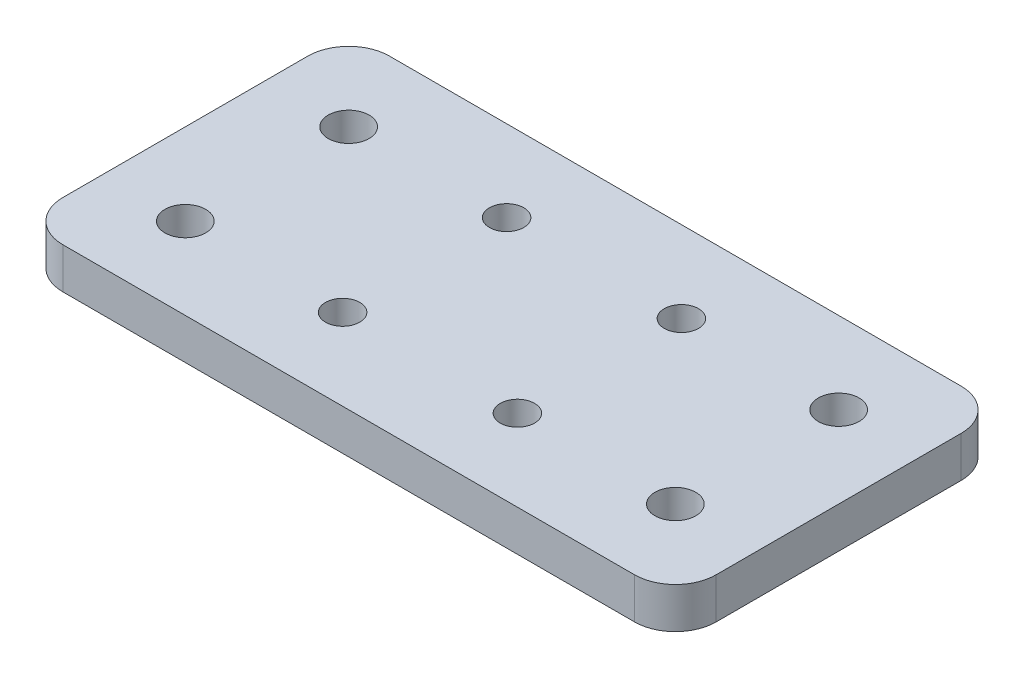
ISO-10303-21;
HEADER;
FILE_DESCRIPTION(('STEP AP214'),'2;1');
FILE_NAME('part.step','',(''),(''),'','','');
FILE_SCHEMA(('AUTOMOTIVE_DESIGN { 1 0 10303 214 1 1 1 1 }'));
ENDSEC;
DATA;
#1=APPLICATION_CONTEXT('core data for automotive mechanical design processes');
#2=APPLICATION_PROTOCOL_DEFINITION('international standard','automotive_design',2000,#1);
#3=PRODUCT_CONTEXT('',#1,'mechanical');
#4=PRODUCT('Part','Part','',(#3));
#5=PRODUCT_RELATED_PRODUCT_CATEGORY('part','',(#4));
#6=PRODUCT_DEFINITION_FORMATION('','',#4);
#7=PRODUCT_DEFINITION_CONTEXT('part definition',#1,'design');
#8=PRODUCT_DEFINITION('design','',#6,#7);
#9=PRODUCT_DEFINITION_SHAPE('','',#8);
#10=(LENGTH_UNIT() NAMED_UNIT(*) SI_UNIT(.MILLI.,.METRE.));
#11=(NAMED_UNIT(*) PLANE_ANGLE_UNIT() SI_UNIT($,.RADIAN.));
#12=(NAMED_UNIT(*) SI_UNIT($,.STERADIAN.) SOLID_ANGLE_UNIT());
#13=UNCERTAINTY_MEASURE_WITH_UNIT(LENGTH_MEASURE(1.E-05),#10,'distance_accuracy_value','');
#14=(GEOMETRIC_REPRESENTATION_CONTEXT(3) GLOBAL_UNCERTAINTY_ASSIGNED_CONTEXT((#13)) GLOBAL_UNIT_ASSIGNED_CONTEXT((#10,
#11,#12)) REPRESENTATION_CONTEXT('',''));
#15=CARTESIAN_POINT('',(0.,0.,0.));
#16=DIRECTION('',(0.,0.,1.));
#17=DIRECTION('',(1.,0.,0.));
#18=AXIS2_PLACEMENT_3D('',#15,#16,#17);
#19=CARTESIAN_POINT('',(50.8,6.35,-25.4));
#20=DIRECTION('',(-1.,0.,0.));
#21=DIRECTION('',(0.,0.,1.));
#22=AXIS2_PLACEMENT_3D('',#19,#20,#21);
#23=PLANE('',#22);
#24=DIRECTION('',(0.,0.,-1.));
#25=VECTOR('',#24,1.);
#26=CARTESIAN_POINT('',(50.8,0.,-25.4));
#27=LINE('',#26,#25);
#28=CARTESIAN_POINT('',(50.8,0.,19.05));
#29=VERTEX_POINT('',#28);
#30=CARTESIAN_POINT('',(50.8,0.,-19.05));
#31=VERTEX_POINT('',#30);
#32=EDGE_CURVE('E128',#29,#31,#27,.T.);
#33=ORIENTED_EDGE('',*,*,#32,.T.);
#34=DIRECTION('',(0.,-1.,0.));
#35=VECTOR('',#34,1.);
#36=CARTESIAN_POINT('',(50.8,6.35,-19.05));
#37=LINE('',#36,#35);
#38=CARTESIAN_POINT('',(50.8,6.35,-19.05));
#39=VERTEX_POINT('',#38);
#40=EDGE_CURVE('E151',#31,#39,#37,.F.);
#41=ORIENTED_EDGE('',*,*,#40,.T.);
#42=DIRECTION('',(0.,0.,-1.));
#43=VECTOR('',#42,1.);
#44=CARTESIAN_POINT('',(50.8,6.35,-25.4));
#45=LINE('',#44,#43);
#46=CARTESIAN_POINT('',(50.8,6.35,19.05));
#47=VERTEX_POINT('',#46);
#48=EDGE_CURVE('E126',#47,#39,#45,.T.);
#49=ORIENTED_EDGE('',*,*,#48,.F.);
#50=DIRECTION('',(0.,-1.,0.));
#51=VECTOR('',#50,1.);
#52=CARTESIAN_POINT('',(50.8,6.35,19.05));
#53=LINE('',#52,#51);
#54=EDGE_CURVE('E148',#47,#29,#53,.T.);
#55=ORIENTED_EDGE('',*,*,#54,.T.);
#56=EDGE_LOOP('',(#33,#41,#49,#55));
#57=FACE_BOUND('',#56,.T.);
#58=ADVANCED_FACE('F33',(#57),#23,.F.);
#59=CARTESIAN_POINT('',(-50.8,6.35,-25.4));
#60=DIRECTION('',(0.,0.,1.));
#61=DIRECTION('',(1.,0.,0.));
#62=AXIS2_PLACEMENT_3D('',#59,#60,#61);
#63=PLANE('',#62);
#64=DIRECTION('',(-1.,0.,0.));
#65=VECTOR('',#64,1.);
#66=CARTESIAN_POINT('',(-50.8,0.,-25.4));
#67=LINE('',#66,#65);
#68=CARTESIAN_POINT('',(44.45,0.,-25.4));
#69=VERTEX_POINT('',#68);
#70=CARTESIAN_POINT('',(-44.45,0.,-25.4));
#71=VERTEX_POINT('',#70);
#72=EDGE_CURVE('E124',#69,#71,#67,.T.);
#73=ORIENTED_EDGE('',*,*,#72,.T.);
#74=DIRECTION('',(0.,-1.,0.));
#75=VECTOR('',#74,1.);
#76=CARTESIAN_POINT('',(-44.45,6.35,-25.4));
#77=LINE('',#76,#75);
#78=CARTESIAN_POINT('',(-44.45,6.35,-25.4));
#79=VERTEX_POINT('',#78);
#80=EDGE_CURVE('E103',#71,#79,#77,.F.);
#81=ORIENTED_EDGE('',*,*,#80,.T.);
#82=DIRECTION('',(-1.,0.,0.));
#83=VECTOR('',#82,1.);
#84=CARTESIAN_POINT('',(-50.8,6.35,-25.4));
#85=LINE('',#84,#83);
#86=CARTESIAN_POINT('',(44.45,6.35,-25.4));
#87=VERTEX_POINT('',#86);
#88=EDGE_CURVE('E167',#87,#79,#85,.T.);
#89=ORIENTED_EDGE('',*,*,#88,.F.);
#90=DIRECTION('',(0.,-1.,0.));
#91=VECTOR('',#90,1.);
#92=CARTESIAN_POINT('',(44.45,6.35,-25.4));
#93=LINE('',#92,#91);
#94=EDGE_CURVE('E108',#87,#69,#93,.T.);
#95=ORIENTED_EDGE('',*,*,#94,.T.);
#96=EDGE_LOOP('',(#73,#81,#89,#95));
#97=FACE_BOUND('',#96,.T.);
#98=ADVANCED_FACE('F261',(#97),#63,.F.);
#99=CARTESIAN_POINT('',(-50.8,6.35,-25.4));
#100=DIRECTION('',(1.,0.,0.));
#101=DIRECTION('',(0.,0.,-1.));
#102=AXIS2_PLACEMENT_3D('',#99,#100,#101);
#103=PLANE('',#102);
#104=DIRECTION('',(0.,0.,1.));
#105=VECTOR('',#104,1.);
#106=CARTESIAN_POINT('',(-50.8,6.35,-25.4));
#107=LINE('',#106,#105);
#108=CARTESIAN_POINT('',(-50.8,6.35,-19.05));
#109=VERTEX_POINT('',#108);
#110=CARTESIAN_POINT('',(-50.8,6.35,19.05));
#111=VERTEX_POINT('',#110);
#112=EDGE_CURVE('E117',#109,#111,#107,.T.);
#113=ORIENTED_EDGE('',*,*,#112,.F.);
#114=DIRECTION('',(0.,-1.,0.));
#115=VECTOR('',#114,1.);
#116=CARTESIAN_POINT('',(-50.8,6.35,-19.05));
#117=LINE('',#116,#115);
#118=CARTESIAN_POINT('',(-50.8,0.,-19.05));
#119=VERTEX_POINT('',#118);
#120=EDGE_CURVE('E102',#109,#119,#117,.T.);
#121=ORIENTED_EDGE('',*,*,#120,.T.);
#122=DIRECTION('',(0.,0.,1.));
#123=VECTOR('',#122,1.);
#124=CARTESIAN_POINT('',(-50.8,0.,-25.4));
#125=LINE('',#124,#123);
#126=CARTESIAN_POINT('',(-50.8,0.,19.05));
#127=VERTEX_POINT('',#126);
#128=EDGE_CURVE('E115',#119,#127,#125,.T.);
#129=ORIENTED_EDGE('',*,*,#128,.T.);
#130=DIRECTION('',(0.,-1.,0.));
#131=VECTOR('',#130,1.);
#132=CARTESIAN_POINT('',(-50.8,6.35,19.05));
#133=LINE('',#132,#131);
#134=EDGE_CURVE('E119',#127,#111,#133,.F.);
#135=ORIENTED_EDGE('',*,*,#134,.T.);
#136=EDGE_LOOP('',(#113,#121,#129,#135));
#137=FACE_BOUND('',#136,.T.);
#138=ADVANCED_FACE('F114',(#137),#103,.F.);
#139=CARTESIAN_POINT('',(-50.8,6.35,25.4));
#140=DIRECTION('',(0.,0.,-1.));
#141=DIRECTION('',(-1.,0.,0.));
#142=AXIS2_PLACEMENT_3D('',#139,#140,#141);
#143=PLANE('',#142);
#144=DIRECTION('',(1.,0.,0.));
#145=VECTOR('',#144,1.);
#146=CARTESIAN_POINT('',(-50.8,0.,25.4));
#147=LINE('',#146,#145);
#148=CARTESIAN_POINT('',(-44.45,0.,25.4));
#149=VERTEX_POINT('',#148);
#150=CARTESIAN_POINT('',(44.45,0.,25.4));
#151=VERTEX_POINT('',#150);
#152=EDGE_CURVE('E123',#149,#151,#147,.T.);
#153=ORIENTED_EDGE('',*,*,#152,.T.);
#154=DIRECTION('',(0.,-1.,0.));
#155=VECTOR('',#154,1.);
#156=CARTESIAN_POINT('',(44.45,6.35,25.4));
#157=LINE('',#156,#155);
#158=CARTESIAN_POINT('',(44.45,6.35,25.4));
#159=VERTEX_POINT('',#158);
#160=EDGE_CURVE('E11',#151,#159,#157,.F.);
#161=ORIENTED_EDGE('',*,*,#160,.T.);
#162=DIRECTION('',(1.,0.,0.));
#163=VECTOR('',#162,1.);
#164=CARTESIAN_POINT('',(-50.8,6.35,25.4));
#165=LINE('',#164,#163);
#166=CARTESIAN_POINT('',(-44.45,6.35,25.4));
#167=VERTEX_POINT('',#166);
#168=EDGE_CURVE('E132',#167,#159,#165,.T.);
#169=ORIENTED_EDGE('',*,*,#168,.F.);
#170=DIRECTION('',(0.,-1.,0.));
#171=VECTOR('',#170,1.);
#172=CARTESIAN_POINT('',(-44.45,6.35,25.4));
#173=LINE('',#172,#171);
#174=EDGE_CURVE('E41',#167,#149,#173,.T.);
#175=ORIENTED_EDGE('',*,*,#174,.T.);
#176=EDGE_LOOP('',(#153,#161,#169,#175));
#177=FACE_BOUND('',#176,.T.);
#178=ADVANCED_FACE('F154',(#177),#143,.F.);
#179=CARTESIAN_POINT('',(0.,6.35,0.));
#180=DIRECTION('',(0.,1.,0.));
#181=DIRECTION('',(0.,0.,1.));
#182=AXIS2_PLACEMENT_3D('',#179,#180,#181);
#183=PLANE('',#182);
#184=CARTESIAN_POINT('',(-13.589,6.35,12.75));
#185=DIRECTION('',(0.,1.,0.));
#186=DIRECTION('',(0.,0.,1.));
#187=AXIS2_PLACEMENT_3D('',#184,#185,#186);
#188=CIRCLE('',#187,2.667);
#189=CARTESIAN_POINT('',(-13.589,6.35,15.417));
#190=VERTEX_POINT('',#189);
#191=EDGE_CURVE('E219',#190,#190,#188,.F.);
#192=ORIENTED_EDGE('',*,*,#191,.T.);
#193=EDGE_LOOP('',(#192));
#194=FACE_BOUND('',#193,.T.);
#195=CARTESIAN_POINT('',(13.589,6.35,12.75));
#196=DIRECTION('',(0.,1.,0.));
#197=DIRECTION('',(0.,0.,1.));
#198=AXIS2_PLACEMENT_3D('',#195,#196,#197);
#199=CIRCLE('',#198,2.667);
#200=CARTESIAN_POINT('',(13.589,6.35,15.417));
#201=VERTEX_POINT('',#200);
#202=EDGE_CURVE('E213',#201,#201,#199,.F.);
#203=ORIENTED_EDGE('',*,*,#202,.T.);
#204=EDGE_LOOP('',(#203));
#205=FACE_BOUND('',#204,.T.);
#206=CARTESIAN_POINT('',(-13.589,6.35,-12.75));
#207=DIRECTION('',(0.,1.,0.));
#208=DIRECTION('',(0.,0.,1.));
#209=AXIS2_PLACEMENT_3D('',#206,#207,#208);
#210=CIRCLE('',#209,2.667);
#211=CARTESIAN_POINT('',(-13.589,6.35,-10.083));
#212=VERTEX_POINT('',#211);
#213=EDGE_CURVE('E207',#212,#212,#210,.F.);
#214=ORIENTED_EDGE('',*,*,#213,.T.);
#215=EDGE_LOOP('',(#214));
#216=FACE_BOUND('',#215,.T.);
#217=CARTESIAN_POINT('',(13.589,6.35,-12.75));
#218=DIRECTION('',(0.,1.,0.));
#219=DIRECTION('',(0.,0.,1.));
#220=AXIS2_PLACEMENT_3D('',#217,#218,#219);
#221=CIRCLE('',#220,2.667);
#222=CARTESIAN_POINT('',(13.589,6.35,-10.083));
#223=VERTEX_POINT('',#222);
#224=EDGE_CURVE('E201',#223,#223,#221,.F.);
#225=ORIENTED_EDGE('',*,*,#224,.T.);
#226=EDGE_LOOP('',(#225));
#227=FACE_BOUND('',#226,.T.);
#228=CARTESIAN_POINT('',(38.1,6.35,-12.7));
#229=DIRECTION('',(0.,1.,0.));
#230=DIRECTION('',(0.,0.,1.));
#231=AXIS2_PLACEMENT_3D('',#228,#229,#230);
#232=CIRCLE('',#231,3.175);
#233=CARTESIAN_POINT('',(38.1,6.35,-9.525));
#234=VERTEX_POINT('',#233);
#235=EDGE_CURVE('E195',#234,#234,#232,.F.);
#236=ORIENTED_EDGE('',*,*,#235,.T.);
#237=EDGE_LOOP('',(#236));
#238=FACE_BOUND('',#237,.T.);
#239=CARTESIAN_POINT('',(38.1,6.35,12.7));
#240=DIRECTION('',(0.,1.,0.));
#241=DIRECTION('',(0.,0.,1.));
#242=AXIS2_PLACEMENT_3D('',#239,#240,#241);
#243=CIRCLE('',#242,3.175);
#244=CARTESIAN_POINT('',(38.1,6.35,15.875));
#245=VERTEX_POINT('',#244);
#246=EDGE_CURVE('E189',#245,#245,#243,.F.);
#247=ORIENTED_EDGE('',*,*,#246,.T.);
#248=EDGE_LOOP('',(#247));
#249=FACE_BOUND('',#248,.T.);
#250=CARTESIAN_POINT('',(-38.1,6.35,-12.7));
#251=DIRECTION('',(0.,1.,0.));
#252=DIRECTION('',(0.,0.,1.));
#253=AXIS2_PLACEMENT_3D('',#250,#251,#252);
#254=CIRCLE('',#253,3.175);
#255=CARTESIAN_POINT('',(-38.1,6.35,-9.52500000000001));
#256=VERTEX_POINT('',#255);
#257=EDGE_CURVE('E183',#256,#256,#254,.F.);
#258=ORIENTED_EDGE('',*,*,#257,.T.);
#259=EDGE_LOOP('',(#258));
#260=FACE_BOUND('',#259,.T.);
#261=CARTESIAN_POINT('',(-38.1,6.35,12.7));
#262=DIRECTION('',(0.,1.,0.));
#263=DIRECTION('',(0.,0.,1.));
#264=AXIS2_PLACEMENT_3D('',#261,#262,#263);
#265=CIRCLE('',#264,3.175);
#266=CARTESIAN_POINT('',(-38.1,6.35,15.875));
#267=VERTEX_POINT('',#266);
#268=EDGE_CURVE('E172',#267,#267,#265,.F.);
#269=ORIENTED_EDGE('',*,*,#268,.T.);
#270=EDGE_LOOP('',(#269));
#271=FACE_BOUND('',#270,.T.);
#272=ORIENTED_EDGE('',*,*,#88,.T.);
#273=CARTESIAN_POINT('',(-44.45,6.35,-19.05));
#274=DIRECTION('',(0.,1.,0.));
#275=DIRECTION('',(0.,0.,1.));
#276=AXIS2_PLACEMENT_3D('',#273,#274,#275);
#277=CIRCLE('',#276,6.35);
#278=EDGE_CURVE('E146',#79,#109,#277,.T.);
#279=ORIENTED_EDGE('',*,*,#278,.T.);
#280=ORIENTED_EDGE('',*,*,#112,.T.);
#281=CARTESIAN_POINT('',(-44.45,6.35,19.05));
#282=DIRECTION('',(0.,1.,0.));
#283=DIRECTION('',(0.,0.,1.));
#284=AXIS2_PLACEMENT_3D('',#281,#282,#283);
#285=CIRCLE('',#284,6.35);
#286=EDGE_CURVE('E53',#111,#167,#285,.T.);
#287=ORIENTED_EDGE('',*,*,#286,.T.);
#288=ORIENTED_EDGE('',*,*,#168,.T.);
#289=CARTESIAN_POINT('',(44.45,6.35,19.05));
#290=DIRECTION('',(0.,1.,0.));
#291=DIRECTION('',(0.,0.,1.));
#292=AXIS2_PLACEMENT_3D('',#289,#290,#291);
#293=CIRCLE('',#292,6.35);
#294=EDGE_CURVE('E142',#159,#47,#293,.T.);
#295=ORIENTED_EDGE('',*,*,#294,.T.);
#296=ORIENTED_EDGE('',*,*,#48,.T.);
#297=CARTESIAN_POINT('',(44.45,6.35,-19.05));
#298=DIRECTION('',(0.,1.,0.));
#299=DIRECTION('',(0.,0.,1.));
#300=AXIS2_PLACEMENT_3D('',#297,#298,#299);
#301=CIRCLE('',#300,6.35);
#302=EDGE_CURVE('E144',#39,#87,#301,.T.);
#303=ORIENTED_EDGE('',*,*,#302,.T.);
#304=EDGE_LOOP('',(#272,#279,#280,#287,#288,#295,#296,#303));
#305=FACE_BOUND('',#304,.T.);
#306=ADVANCED_FACE('F230',(#194,#205,#216,#227,#238,#249,#260,#271,#305),#183,.T.);
#307=CARTESIAN_POINT('',(0.,0.,0.));
#308=DIRECTION('',(0.,1.,0.));
#309=DIRECTION('',(0.,0.,1.));
#310=AXIS2_PLACEMENT_3D('',#307,#308,#309);
#311=PLANE('',#310);
#312=CARTESIAN_POINT('',(-13.589,0.,12.75));
#313=DIRECTION('',(0.,-1.,0.));
#314=DIRECTION('',(0.,0.,1.));
#315=AXIS2_PLACEMENT_3D('',#312,#313,#314);
#316=CIRCLE('',#315,2.667);
#317=CARTESIAN_POINT('',(-13.589,0.,15.417));
#318=VERTEX_POINT('',#317);
#319=EDGE_CURVE('E216',#318,#318,#316,.T.);
#320=ORIENTED_EDGE('',*,*,#319,.F.);
#321=EDGE_LOOP('',(#320));
#322=FACE_BOUND('',#321,.T.);
#323=CARTESIAN_POINT('',(13.589,0.,12.75));
#324=DIRECTION('',(0.,-1.,0.));
#325=DIRECTION('',(0.,0.,-1.));
#326=AXIS2_PLACEMENT_3D('',#323,#324,#325);
#327=CIRCLE('',#326,2.667);
#328=CARTESIAN_POINT('',(13.589,0.,10.083));
#329=VERTEX_POINT('',#328);
#330=EDGE_CURVE('E210',#329,#329,#327,.T.);
#331=ORIENTED_EDGE('',*,*,#330,.F.);
#332=EDGE_LOOP('',(#331));
#333=FACE_BOUND('',#332,.T.);
#334=CARTESIAN_POINT('',(-13.589,0.,-12.75));
#335=DIRECTION('',(0.,-1.,0.));
#336=DIRECTION('',(0.,0.,-1.));
#337=AXIS2_PLACEMENT_3D('',#334,#335,#336);
#338=CIRCLE('',#337,2.667);
#339=CARTESIAN_POINT('',(-13.589,0.,-15.417));
#340=VERTEX_POINT('',#339);
#341=EDGE_CURVE('E204',#340,#340,#338,.T.);
#342=ORIENTED_EDGE('',*,*,#341,.F.);
#343=EDGE_LOOP('',(#342));
#344=FACE_BOUND('',#343,.T.);
#345=CARTESIAN_POINT('',(13.589,0.,-12.75));
#346=DIRECTION('',(0.,-1.,0.));
#347=DIRECTION('',(0.,0.,1.));
#348=AXIS2_PLACEMENT_3D('',#345,#346,#347);
#349=CIRCLE('',#348,2.667);
#350=CARTESIAN_POINT('',(13.589,0.,-10.083));
#351=VERTEX_POINT('',#350);
#352=EDGE_CURVE('E198',#351,#351,#349,.T.);
#353=ORIENTED_EDGE('',*,*,#352,.F.);
#354=EDGE_LOOP('',(#353));
#355=FACE_BOUND('',#354,.T.);
#356=CARTESIAN_POINT('',(38.1,0.,-12.7));
#357=DIRECTION('',(0.,-1.,0.));
#358=DIRECTION('',(0.,0.,-1.));
#359=AXIS2_PLACEMENT_3D('',#356,#357,#358);
#360=CIRCLE('',#359,3.175);
#361=CARTESIAN_POINT('',(38.1,0.,-15.875));
#362=VERTEX_POINT('',#361);
#363=EDGE_CURVE('E192',#362,#362,#360,.T.);
#364=ORIENTED_EDGE('',*,*,#363,.F.);
#365=EDGE_LOOP('',(#364));
#366=FACE_BOUND('',#365,.T.);
#367=CARTESIAN_POINT('',(38.1,0.,12.7));
#368=DIRECTION('',(0.,-1.,0.));
#369=DIRECTION('',(0.,0.,1.));
#370=AXIS2_PLACEMENT_3D('',#367,#368,#369);
#371=CIRCLE('',#370,3.175);
#372=CARTESIAN_POINT('',(38.1,0.,15.875));
#373=VERTEX_POINT('',#372);
#374=EDGE_CURVE('E186',#373,#373,#371,.T.);
#375=ORIENTED_EDGE('',*,*,#374,.F.);
#376=EDGE_LOOP('',(#375));
#377=FACE_BOUND('',#376,.T.);
#378=CARTESIAN_POINT('',(-38.1,0.,-12.7));
#379=DIRECTION('',(0.,-1.,0.));
#380=DIRECTION('',(0.,0.,1.));
#381=AXIS2_PLACEMENT_3D('',#378,#379,#380);
#382=CIRCLE('',#381,3.175);
#383=CARTESIAN_POINT('',(-38.1,0.,-9.52500000000001));
#384=VERTEX_POINT('',#383);
#385=EDGE_CURVE('E181',#384,#384,#382,.T.);
#386=ORIENTED_EDGE('',*,*,#385,.F.);
#387=EDGE_LOOP('',(#386));
#388=FACE_BOUND('',#387,.T.);
#389=CARTESIAN_POINT('',(-38.1,0.,12.7));
#390=DIRECTION('',(0.,-1.,0.));
#391=DIRECTION('',(0.,0.,-1.));
#392=AXIS2_PLACEMENT_3D('',#389,#390,#391);
#393=CIRCLE('',#392,3.175);
#394=CARTESIAN_POINT('',(-38.1,0.,9.52500000000001));
#395=VERTEX_POINT('',#394);
#396=EDGE_CURVE('E176',#395,#395,#393,.T.);
#397=ORIENTED_EDGE('',*,*,#396,.F.);
#398=EDGE_LOOP('',(#397));
#399=FACE_BOUND('',#398,.T.);
#400=ORIENTED_EDGE('',*,*,#128,.F.);
#401=CARTESIAN_POINT('',(-44.45,0.,-19.05));
#402=DIRECTION('',(0.,1.,0.));
#403=DIRECTION('',(0.,0.,1.));
#404=AXIS2_PLACEMENT_3D('',#401,#402,#403);
#405=CIRCLE('',#404,6.35);
#406=EDGE_CURVE('E98',#119,#71,#405,.F.);
#407=ORIENTED_EDGE('',*,*,#406,.T.);
#408=ORIENTED_EDGE('',*,*,#72,.F.);
#409=CARTESIAN_POINT('',(44.45,0.,-19.05));
#410=DIRECTION('',(0.,1.,0.));
#411=DIRECTION('',(0.,0.,1.));
#412=AXIS2_PLACEMENT_3D('',#409,#410,#411);
#413=CIRCLE('',#412,6.35);
#414=EDGE_CURVE('E109',#69,#31,#413,.F.);
#415=ORIENTED_EDGE('',*,*,#414,.T.);
#416=ORIENTED_EDGE('',*,*,#32,.F.);
#417=CARTESIAN_POINT('',(44.45,0.,19.05));
#418=DIRECTION('',(0.,1.,0.));
#419=DIRECTION('',(0.,0.,1.));
#420=AXIS2_PLACEMENT_3D('',#417,#418,#419);
#421=CIRCLE('',#420,6.35);
#422=EDGE_CURVE('E135',#29,#151,#421,.F.);
#423=ORIENTED_EDGE('',*,*,#422,.T.);
#424=ORIENTED_EDGE('',*,*,#152,.F.);
#425=CARTESIAN_POINT('',(-44.45,0.,19.05));
#426=DIRECTION('',(0.,1.,0.));
#427=DIRECTION('',(0.,0.,1.));
#428=AXIS2_PLACEMENT_3D('',#425,#426,#427);
#429=CIRCLE('',#428,6.35);
#430=EDGE_CURVE('E118',#149,#127,#429,.F.);
#431=ORIENTED_EDGE('',*,*,#430,.T.);
#432=EDGE_LOOP('',(#400,#407,#408,#415,#416,#423,#424,#431));
#433=FACE_BOUND('',#432,.T.);
#434=ADVANCED_FACE('F121',(#322,#333,#344,#355,#366,#377,#388,#399,#433),#311,.F.);
#435=CARTESIAN_POINT('',(-38.1,6.351,12.7));
#436=DIRECTION('',(0.,-1.,0.));
#437=DIRECTION('',(0.,0.,-1.));
#438=AXIS2_PLACEMENT_3D('',#435,#436,#437);
#439=CYLINDRICAL_SURFACE('',#438,3.175);
#440=ORIENTED_EDGE('',*,*,#268,.F.);
#441=EDGE_LOOP('',(#440));
#442=FACE_BOUND('',#441,.T.);
#443=ORIENTED_EDGE('',*,*,#396,.T.);
#444=EDGE_LOOP('',(#443));
#445=FACE_BOUND('',#444,.T.);
#446=ADVANCED_FACE('F229',(#442,#445),#439,.F.);
#447=CARTESIAN_POINT('',(-38.1,6.351,-12.7));
#448=DIRECTION('',(0.,-1.,0.));
#449=DIRECTION('',(0.,0.,-1.));
#450=AXIS2_PLACEMENT_3D('',#447,#448,#449);
#451=CYLINDRICAL_SURFACE('',#450,3.175);
#452=ORIENTED_EDGE('',*,*,#257,.F.);
#453=EDGE_LOOP('',(#452));
#454=FACE_BOUND('',#453,.T.);
#455=ORIENTED_EDGE('',*,*,#385,.T.);
#456=EDGE_LOOP('',(#455));
#457=FACE_BOUND('',#456,.T.);
#458=ADVANCED_FACE('F245',(#454,#457),#451,.F.);
#459=CARTESIAN_POINT('',(38.1,6.351,12.7));
#460=DIRECTION('',(0.,-1.,0.));
#461=DIRECTION('',(0.,0.,-1.));
#462=AXIS2_PLACEMENT_3D('',#459,#460,#461);
#463=CYLINDRICAL_SURFACE('',#462,3.175);
#464=ORIENTED_EDGE('',*,*,#246,.F.);
#465=EDGE_LOOP('',(#464));
#466=FACE_BOUND('',#465,.T.);
#467=ORIENTED_EDGE('',*,*,#374,.T.);
#468=EDGE_LOOP('',(#467));
#469=FACE_BOUND('',#468,.T.);
#470=ADVANCED_FACE('F247',(#466,#469),#463,.F.);
#471=CARTESIAN_POINT('',(38.1,6.351,-12.7));
#472=DIRECTION('',(0.,-1.,0.));
#473=DIRECTION('',(0.,0.,-1.));
#474=AXIS2_PLACEMENT_3D('',#471,#472,#473);
#475=CYLINDRICAL_SURFACE('',#474,3.175);
#476=ORIENTED_EDGE('',*,*,#235,.F.);
#477=EDGE_LOOP('',(#476));
#478=FACE_BOUND('',#477,.T.);
#479=ORIENTED_EDGE('',*,*,#363,.T.);
#480=EDGE_LOOP('',(#479));
#481=FACE_BOUND('',#480,.T.);
#482=ADVANCED_FACE('F254',(#478,#481),#475,.F.);
#483=CARTESIAN_POINT('',(13.589,6.351,-12.75));
#484=DIRECTION('',(0.,-1.,0.));
#485=DIRECTION('',(0.,0.,-1.));
#486=AXIS2_PLACEMENT_3D('',#483,#484,#485);
#487=CYLINDRICAL_SURFACE('',#486,2.667);
#488=ORIENTED_EDGE('',*,*,#224,.F.);
#489=EDGE_LOOP('',(#488));
#490=FACE_BOUND('',#489,.T.);
#491=ORIENTED_EDGE('',*,*,#352,.T.);
#492=EDGE_LOOP('',(#491));
#493=FACE_BOUND('',#492,.T.);
#494=ADVANCED_FACE('F355',(#490,#493),#487,.F.);
#495=CARTESIAN_POINT('',(-13.589,6.351,-12.75));
#496=DIRECTION('',(0.,-1.,0.));
#497=DIRECTION('',(0.,0.,-1.));
#498=AXIS2_PLACEMENT_3D('',#495,#496,#497);
#499=CYLINDRICAL_SURFACE('',#498,2.667);
#500=ORIENTED_EDGE('',*,*,#213,.F.);
#501=EDGE_LOOP('',(#500));
#502=FACE_BOUND('',#501,.T.);
#503=ORIENTED_EDGE('',*,*,#341,.T.);
#504=EDGE_LOOP('',(#503));
#505=FACE_BOUND('',#504,.T.);
#506=ADVANCED_FACE('F347',(#502,#505),#499,.F.);
#507=CARTESIAN_POINT('',(13.589,6.351,12.75));
#508=DIRECTION('',(0.,-1.,0.));
#509=DIRECTION('',(0.,0.,-1.));
#510=AXIS2_PLACEMENT_3D('',#507,#508,#509);
#511=CYLINDRICAL_SURFACE('',#510,2.667);
#512=ORIENTED_EDGE('',*,*,#202,.F.);
#513=EDGE_LOOP('',(#512));
#514=FACE_BOUND('',#513,.T.);
#515=ORIENTED_EDGE('',*,*,#330,.T.);
#516=EDGE_LOOP('',(#515));
#517=FACE_BOUND('',#516,.T.);
#518=ADVANCED_FACE('F340',(#514,#517),#511,.F.);
#519=CARTESIAN_POINT('',(-13.589,6.351,12.75));
#520=DIRECTION('',(0.,-1.,0.));
#521=DIRECTION('',(0.,0.,-1.));
#522=AXIS2_PLACEMENT_3D('',#519,#520,#521);
#523=CYLINDRICAL_SURFACE('',#522,2.667);
#524=ORIENTED_EDGE('',*,*,#191,.F.);
#525=EDGE_LOOP('',(#524));
#526=FACE_BOUND('',#525,.T.);
#527=ORIENTED_EDGE('',*,*,#319,.T.);
#528=EDGE_LOOP('',(#527));
#529=FACE_BOUND('',#528,.T.);
#530=ADVANCED_FACE('F225',(#526,#529),#523,.F.);
#531=CARTESIAN_POINT('',(-44.45,6.35,-19.05));
#532=DIRECTION('',(0.,-1.,0.));
#533=DIRECTION('',(0.,0.,-1.));
#534=AXIS2_PLACEMENT_3D('',#531,#532,#533);
#535=CYLINDRICAL_SURFACE('',#534,6.35);
#536=ORIENTED_EDGE('',*,*,#278,.F.);
#537=ORIENTED_EDGE('',*,*,#80,.F.);
#538=ORIENTED_EDGE('',*,*,#406,.F.);
#539=ORIENTED_EDGE('',*,*,#120,.F.);
#540=EDGE_LOOP('',(#536,#537,#538,#539));
#541=FACE_BOUND('',#540,.T.);
#542=ADVANCED_FACE('F101',(#541),#535,.T.);
#543=CARTESIAN_POINT('',(44.45,6.35,-19.05));
#544=DIRECTION('',(0.,-1.,0.));
#545=DIRECTION('',(0.,0.,-1.));
#546=AXIS2_PLACEMENT_3D('',#543,#544,#545);
#547=CYLINDRICAL_SURFACE('',#546,6.35);
#548=ORIENTED_EDGE('',*,*,#302,.F.);
#549=ORIENTED_EDGE('',*,*,#40,.F.);
#550=ORIENTED_EDGE('',*,*,#414,.F.);
#551=ORIENTED_EDGE('',*,*,#94,.F.);
#552=EDGE_LOOP('',(#548,#549,#550,#551));
#553=FACE_BOUND('',#552,.T.);
#554=ADVANCED_FACE('F272',(#553),#547,.T.);
#555=CARTESIAN_POINT('',(44.45,6.35,19.05));
#556=DIRECTION('',(0.,-1.,0.));
#557=DIRECTION('',(0.,0.,-1.));
#558=AXIS2_PLACEMENT_3D('',#555,#556,#557);
#559=CYLINDRICAL_SURFACE('',#558,6.35);
#560=ORIENTED_EDGE('',*,*,#294,.F.);
#561=ORIENTED_EDGE('',*,*,#160,.F.);
#562=ORIENTED_EDGE('',*,*,#422,.F.);
#563=ORIENTED_EDGE('',*,*,#54,.F.);
#564=EDGE_LOOP('',(#560,#561,#562,#563));
#565=FACE_BOUND('',#564,.T.);
#566=ADVANCED_FACE('F161',(#565),#559,.T.);
#567=CARTESIAN_POINT('',(-44.45,6.35,19.05));
#568=DIRECTION('',(0.,-1.,0.));
#569=DIRECTION('',(0.,0.,-1.));
#570=AXIS2_PLACEMENT_3D('',#567,#568,#569);
#571=CYLINDRICAL_SURFACE('',#570,6.35);
#572=ORIENTED_EDGE('',*,*,#286,.F.);
#573=ORIENTED_EDGE('',*,*,#134,.F.);
#574=ORIENTED_EDGE('',*,*,#430,.F.);
#575=ORIENTED_EDGE('',*,*,#174,.F.);
#576=EDGE_LOOP('',(#572,#573,#574,#575));
#577=FACE_BOUND('',#576,.T.);
#578=ADVANCED_FACE('F35',(#577),#571,.T.);
#579=CLOSED_SHELL('',(#58,#98,#138,#178,#306,#434,#446,#458,#470,#482,#494,#506,#518,#530,#542,
#554,#566,#578));
#580=MANIFOLD_SOLID_BREP('B2',#579);
#581=ADVANCED_BREP_SHAPE_REPRESENTATION('',(#18,#580),#14);
#582=SHAPE_DEFINITION_REPRESENTATION(#9,#581);
ENDSEC;
END-ISO-10303-21;
